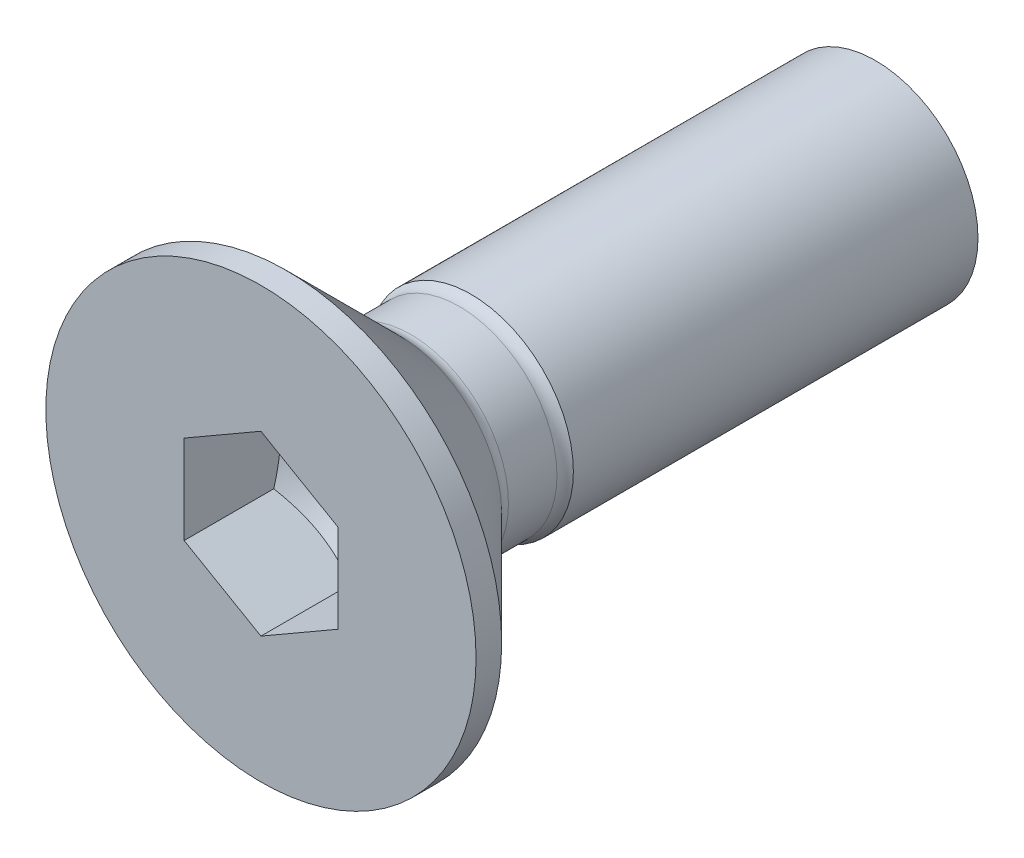
ISO-10303-21;
HEADER;
FILE_DESCRIPTION(('STEP AP214'),'2;1');
FILE_NAME('part.step','',(''),(''),'','','');
FILE_SCHEMA(('AUTOMOTIVE_DESIGN { 1 0 10303 214 1 1 1 1 }'));
ENDSEC;
DATA;
#1=APPLICATION_CONTEXT('core data for automotive mechanical design processes');
#2=APPLICATION_PROTOCOL_DEFINITION('international standard','automotive_design',2000,#1);
#3=PRODUCT_CONTEXT('',#1,'mechanical');
#4=PRODUCT('Part','Part','',(#3));
#5=PRODUCT_RELATED_PRODUCT_CATEGORY('part','',(#4));
#6=PRODUCT_DEFINITION_FORMATION('','',#4);
#7=PRODUCT_DEFINITION_CONTEXT('part definition',#1,'design');
#8=PRODUCT_DEFINITION('design','',#6,#7);
#9=PRODUCT_DEFINITION_SHAPE('','',#8);
#10=(LENGTH_UNIT() NAMED_UNIT(*) SI_UNIT(.MILLI.,.METRE.));
#11=(NAMED_UNIT(*) PLANE_ANGLE_UNIT() SI_UNIT($,.RADIAN.));
#12=(NAMED_UNIT(*) SI_UNIT($,.STERADIAN.) SOLID_ANGLE_UNIT());
#13=UNCERTAINTY_MEASURE_WITH_UNIT(LENGTH_MEASURE(1.E-05),#10,'distance_accuracy_value','');
#14=(GEOMETRIC_REPRESENTATION_CONTEXT(3) GLOBAL_UNCERTAINTY_ASSIGNED_CONTEXT((#13)) GLOBAL_UNIT_ASSIGNED_CONTEXT((#10,
#11,#12)) REPRESENTATION_CONTEXT('',''));
#15=CARTESIAN_POINT('',(0.,0.,0.));
#16=DIRECTION('',(0.,0.,1.));
#17=DIRECTION('',(1.,0.,0.));
#18=AXIS2_PLACEMENT_3D('',#15,#16,#17);
#19=CARTESIAN_POINT('',(0.,4.2,0.));
#20=DIRECTION('',(0.,0.,-1.));
#21=DIRECTION('',(-1.,0.,0.));
#22=AXIS2_PLACEMENT_3D('',#19,#20,#21);
#23=PLANE('',#22);
#24=CARTESIAN_POINT('',(0.,0.,0.));
#25=DIRECTION('',(0.,0.,1.));
#26=DIRECTION('',(1.,0.,0.));
#27=AXIS2_PLACEMENT_3D('',#24,#25,#26);
#28=CIRCLE('',#27,4.2);
#29=CARTESIAN_POINT('',(4.2,0.,0.));
#30=VERTEX_POINT('',#29);
#31=EDGE_CURVE('E107',#30,#30,#28,.T.);
#32=ORIENTED_EDGE('',*,*,#31,.T.);
#33=EDGE_LOOP('',(#32));
#34=FACE_BOUND('',#33,.T.);
#35=DIRECTION('',(-0.866025403784438,-0.5,0.));
#36=VECTOR('',#35,1.);
#37=CARTESIAN_POINT('',(1.49999930062484,-0.866025,0.));
#38=LINE('',#37,#36);
#39=CARTESIAN_POINT('',(1.49999930062484,-0.866025,0.));
#40=VERTEX_POINT('',#39);
#41=CARTESIAN_POINT('',(0.,-1.73205,0.));
#42=VERTEX_POINT('',#41);
#43=EDGE_CURVE('E31',#40,#42,#38,.T.);
#44=ORIENTED_EDGE('',*,*,#43,.T.);
#45=DIRECTION('',(-0.866025403784439,0.5,0.));
#46=VECTOR('',#45,1.);
#47=CARTESIAN_POINT('',(0.,-1.73205,0.));
#48=LINE('',#47,#46);
#49=CARTESIAN_POINT('',(-1.49999930062484,-0.866025,0.));
#50=VERTEX_POINT('',#49);
#51=EDGE_CURVE('E174',#42,#50,#48,.T.);
#52=ORIENTED_EDGE('',*,*,#51,.T.);
#53=DIRECTION('',(0.,1.,0.));
#54=VECTOR('',#53,1.);
#55=CARTESIAN_POINT('',(-1.49999930062484,-0.866025,0.));
#56=LINE('',#55,#54);
#57=CARTESIAN_POINT('',(-1.49999930062484,0.866025,0.));
#58=VERTEX_POINT('',#57);
#59=EDGE_CURVE('E225',#50,#58,#56,.T.);
#60=ORIENTED_EDGE('',*,*,#59,.T.);
#61=DIRECTION('',(0.866025403784439,0.5,0.));
#62=VECTOR('',#61,1.);
#63=CARTESIAN_POINT('',(-1.49999930062484,0.866025,0.));
#64=LINE('',#63,#62);
#65=CARTESIAN_POINT('',(0.,1.73205,0.));
#66=VERTEX_POINT('',#65);
#67=EDGE_CURVE('E223',#58,#66,#64,.T.);
#68=ORIENTED_EDGE('',*,*,#67,.T.);
#69=DIRECTION('',(0.866025403784439,-0.5,0.));
#70=VECTOR('',#69,1.);
#71=CARTESIAN_POINT('',(0.,1.73205,0.));
#72=LINE('',#71,#70);
#73=CARTESIAN_POINT('',(1.49999930062484,0.866025,0.));
#74=VERTEX_POINT('',#73);
#75=EDGE_CURVE('E96',#66,#74,#72,.T.);
#76=ORIENTED_EDGE('',*,*,#75,.T.);
#77=DIRECTION('',(0.,-1.,0.));
#78=VECTOR('',#77,1.);
#79=CARTESIAN_POINT('',(1.49999930062484,0.866025,0.));
#80=LINE('',#79,#78);
#81=EDGE_CURVE('E92',#74,#40,#80,.T.);
#82=ORIENTED_EDGE('',*,*,#81,.T.);
#83=EDGE_LOOP('',(#44,#52,#60,#68,#76,#82));
#84=FACE_BOUND('',#83,.T.);
#85=ADVANCED_FACE('F17',(#34,#84),#23,.F.);
#86=CARTESIAN_POINT('',(0.,0.,-12.));
#87=DIRECTION('',(0.,0.,1.));
#88=DIRECTION('',(1.,0.,0.));
#89=AXIS2_PLACEMENT_3D('',#86,#87,#88);
#90=PLANE('',#89);
#91=CARTESIAN_POINT('',(0.,0.,-12.));
#92=DIRECTION('',(0.,0.,1.));
#93=DIRECTION('',(1.,0.,0.));
#94=AXIS2_PLACEMENT_3D('',#91,#92,#93);
#95=CIRCLE('',#94,2.);
#96=CARTESIAN_POINT('',(2.,0.,-12.));
#97=VERTEX_POINT('',#96);
#98=EDGE_CURVE('E11',#97,#97,#95,.T.);
#99=ORIENTED_EDGE('',*,*,#98,.F.);
#100=EDGE_LOOP('',(#99));
#101=FACE_BOUND('',#100,.T.);
#102=ADVANCED_FACE('F130',(#101),#90,.F.);
#103=CARTESIAN_POINT('',(0.,0.,0.));
#104=DIRECTION('',(0.,0.,1.));
#105=DIRECTION('',(1.,0.,0.));
#106=AXIS2_PLACEMENT_3D('',#103,#104,#105);
#107=CYLINDRICAL_SURFACE('',#106,2.);
#108=CARTESIAN_POINT('',(0.,0.,-4.1));
#109=DIRECTION('',(0.,0.,1.));
#110=DIRECTION('',(1.,0.,0.));
#111=AXIS2_PLACEMENT_3D('',#108,#109,#110);
#112=CIRCLE('',#111,2.);
#113=CARTESIAN_POINT('',(2.,0.,-4.1));
#114=VERTEX_POINT('',#113);
#115=EDGE_CURVE('E24',#114,#114,#112,.T.);
#116=ORIENTED_EDGE('',*,*,#115,.F.);
#117=EDGE_LOOP('',(#116));
#118=FACE_BOUND('',#117,.T.);
#119=ORIENTED_EDGE('',*,*,#98,.T.);
#120=EDGE_LOOP('',(#119));
#121=FACE_BOUND('',#120,.T.);
#122=ADVANCED_FACE('F127',(#118,#121),#107,.T.);
#123=CARTESIAN_POINT('',(0.,0.,-3.8737258300203));
#124=DIRECTION('',(0.,0.,1.));
#125=DIRECTION('',(1.,0.,0.));
#126=AXIS2_PLACEMENT_3D('',#123,#124,#125);
#127=TOROIDAL_SURFACE('',#126,2.2262741699797,0.32);
#128=ORIENTED_EDGE('',*,*,#115,.T.);
#129=EDGE_LOOP('',(#128));
#130=FACE_BOUND('',#129,.T.);
#131=CARTESIAN_POINT('',(0.,0.,-3.8737258300203));
#132=DIRECTION('',(0.,0.,1.));
#133=DIRECTION('',(1.,0.,0.));
#134=AXIS2_PLACEMENT_3D('',#131,#132,#133);
#135=CIRCLE('',#134,1.9062741699797);
#136=CARTESIAN_POINT('',(1.9062741699797,0.,-3.8737258300203));
#137=VERTEX_POINT('',#136);
#138=EDGE_CURVE('E119',#137,#137,#135,.T.);
#139=ORIENTED_EDGE('',*,*,#138,.F.);
#140=EDGE_LOOP('',(#139));
#141=FACE_BOUND('',#140,.T.);
#142=ADVANCED_FACE('F124',(#130,#141),#127,.F.);
#143=CARTESIAN_POINT('',(0.,0.,0.));
#144=DIRECTION('',(0.,0.,1.));
#145=DIRECTION('',(1.,0.,0.));
#146=AXIS2_PLACEMENT_3D('',#143,#144,#145);
#147=CYLINDRICAL_SURFACE('',#146,1.9062741699797);
#148=CARTESIAN_POINT('',(0.,0.,-2.9262741699797));
#149=DIRECTION('',(0.,0.,1.));
#150=DIRECTION('',(1.,0.,0.));
#151=AXIS2_PLACEMENT_3D('',#148,#149,#150);
#152=CIRCLE('',#151,1.9062741699797);
#153=CARTESIAN_POINT('',(1.9062741699797,0.,-2.9262741699797));
#154=VERTEX_POINT('',#153);
#155=EDGE_CURVE('E116',#154,#154,#152,.T.);
#156=ORIENTED_EDGE('',*,*,#155,.F.);
#157=EDGE_LOOP('',(#156));
#158=FACE_BOUND('',#157,.T.);
#159=ORIENTED_EDGE('',*,*,#138,.T.);
#160=EDGE_LOOP('',(#159));
#161=FACE_BOUND('',#160,.T.);
#162=ADVANCED_FACE('F143',(#158,#161),#147,.T.);
#163=CARTESIAN_POINT('',(0.,0.,-2.9262741699797));
#164=DIRECTION('',(0.,0.,1.));
#165=DIRECTION('',(1.,0.,0.));
#166=AXIS2_PLACEMENT_3D('',#163,#164,#165);
#167=TOROIDAL_SURFACE('',#166,2.2262741699797,0.32);
#168=ORIENTED_EDGE('',*,*,#155,.T.);
#169=EDGE_LOOP('',(#168));
#170=FACE_BOUND('',#169,.T.);
#171=CARTESIAN_POINT('',(0.,0.,-2.7));
#172=DIRECTION('',(0.,0.,1.));
#173=DIRECTION('',(1.,0.,0.));
#174=AXIS2_PLACEMENT_3D('',#171,#172,#173);
#175=CIRCLE('',#174,2.);
#176=CARTESIAN_POINT('',(2.,0.,-2.7));
#177=VERTEX_POINT('',#176);
#178=EDGE_CURVE('E113',#177,#177,#175,.T.);
#179=ORIENTED_EDGE('',*,*,#178,.F.);
#180=EDGE_LOOP('',(#179));
#181=FACE_BOUND('',#180,.T.);
#182=ADVANCED_FACE('F146',(#170,#181),#167,.F.);
#183=CARTESIAN_POINT('',(0.,0.,-2.7));
#184=DIRECTION('',(0.,0.,1.));
#185=DIRECTION('',(1.,0.,0.));
#186=AXIS2_PLACEMENT_3D('',#183,#184,#185);
#187=CONICAL_SURFACE('',#186,2.,0.785398163397448);
#188=CARTESIAN_POINT('',(0.,0.,-0.5));
#189=DIRECTION('',(0.,0.,1.));
#190=DIRECTION('',(1.,0.,0.));
#191=AXIS2_PLACEMENT_3D('',#188,#189,#190);
#192=CIRCLE('',#191,4.2);
#193=CARTESIAN_POINT('',(4.2,0.,-0.5));
#194=VERTEX_POINT('',#193);
#195=EDGE_CURVE('E110',#194,#194,#192,.T.);
#196=ORIENTED_EDGE('',*,*,#195,.F.);
#197=EDGE_LOOP('',(#196));
#198=FACE_BOUND('',#197,.T.);
#199=ORIENTED_EDGE('',*,*,#178,.T.);
#200=EDGE_LOOP('',(#199));
#201=FACE_BOUND('',#200,.T.);
#202=ADVANCED_FACE('F150',(#198,#201),#187,.T.);
#203=CARTESIAN_POINT('',(0.,0.,0.));
#204=DIRECTION('',(0.,0.,1.));
#205=DIRECTION('',(1.,0.,0.));
#206=AXIS2_PLACEMENT_3D('',#203,#204,#205);
#207=CYLINDRICAL_SURFACE('',#206,4.2);
#208=ORIENTED_EDGE('',*,*,#31,.F.);
#209=EDGE_LOOP('',(#208));
#210=FACE_BOUND('',#209,.T.);
#211=ORIENTED_EDGE('',*,*,#195,.T.);
#212=EDGE_LOOP('',(#211));
#213=FACE_BOUND('',#212,.T.);
#214=ADVANCED_FACE('F154',(#210,#213),#207,.T.);
#215=CARTESIAN_POINT('',(1.49999930062484,-0.866025,-2.74999953374989));
#216=DIRECTION('',(-0.5,0.866025403784438,0.));
#217=DIRECTION('',(0.866025403784439,0.5,0.));
#218=AXIS2_PLACEMENT_3D('',#215,#216,#217);
#219=PLANE('',#218);
#220=DIRECTION('',(0.,0.,1.));
#221=VECTOR('',#220,1.);
#222=CARTESIAN_POINT('',(0.,-1.73205,-2.74999953374989));
#223=LINE('',#222,#221);
#224=CARTESIAN_POINT('',(0.,-1.73205,-1.75));
#225=VERTEX_POINT('',#224);
#226=EDGE_CURVE('E105',#225,#42,#223,.T.);
#227=ORIENTED_EDGE('',*,*,#226,.T.);
#228=ORIENTED_EDGE('',*,*,#43,.F.);
#229=DIRECTION('',(0.,0.,1.));
#230=VECTOR('',#229,1.);
#231=CARTESIAN_POINT('',(1.49999930062484,-0.866025,-2.74999953374989));
#232=LINE('',#231,#230);
#233=CARTESIAN_POINT('',(1.49999930062484,-0.866025,-1.75));
#234=VERTEX_POINT('',#233);
#235=EDGE_CURVE('E86',#234,#40,#232,.T.);
#236=ORIENTED_EDGE('',*,*,#235,.F.);
#237=CARTESIAN_POINT('',(-1.99999999680739E-07,-1.73205011547005,-1.74999993333332));
#238=CARTESIAN_POINT('',(0.0659156883140374,-1.69399355960807,-1.77197826971665));
#239=CARTESIAN_POINT('',(0.132400561630831,-1.65560850010158,-1.79196641723317));
#240=CARTESIAN_POINT('',(0.266521449648073,-1.57817376930088,-1.82685513031264));
#241=CARTESIAN_POINT('',(0.334159846643437,-1.53912272258805,-1.84174335491524));
#242=CARTESIAN_POINT('',(0.468598431785278,-1.46150456926693,-1.86491795250505));
#243=CARTESIAN_POINT('',(0.535377940612902,-1.42294940186895,-1.87335858322253));
#244=CARTESIAN_POINT('',(0.669251014383081,-1.3456577466905,-1.88343305499451));
#245=CARTESIAN_POINT('',(0.736344093066486,-1.30692153965187,-1.88507524057936));
#246=CARTESIAN_POINT('',(0.861700339375889,-1.23454707710054,-1.88165022910074));
#247=CARTESIAN_POINT('',(0.919982317618543,-1.20089796127324,-1.87742398588357));
#248=CARTESIAN_POINT('',(1.03616658598195,-1.13381894265803,-1.86403197749463));
#249=CARTESIAN_POINT('',(1.09406847455153,-1.10038927170579,-1.8548616421055));
#250=CARTESIAN_POINT('',(1.21049209394498,-1.03317206370895,-1.83193757598473));
#251=CARTESIAN_POINT('',(1.26899909720332,-0.99939302962827,-1.81808671686208));
#252=CARTESIAN_POINT('',(1.38514072357652,-0.932338630377582,-1.78665112132236));
#253=CARTESIAN_POINT('',(1.44277683345494,-0.899062406824236,-1.76907376628985));
#254=CARTESIAN_POINT('',(1.49999950062484,-0.866024884529945,-1.74999993333332));
#255=B_SPLINE_CURVE_WITH_KNOTS('',3,(#237,#238,#239,#240,#241,#242,#243,#244,#245,#246,#247,
#248,#249,#250,#251,#252,#253,#254),.UNSPECIFIED.,.F.,.F.,(4,2,2,2,2,2,2,2,4),(0.,
0.237761913623106,0.476095172847885,0.708530420620331,0.940680288567599,1.14278046683928,
1.34506778348019,1.5518408666055,1.75820814090333),.UNSPECIFIED.);
#256=EDGE_CURVE('E79',#225,#234,#255,.T.);
#257=ORIENTED_EDGE('',*,*,#256,.F.);
#258=EDGE_LOOP('',(#227,#228,#236,#257));
#259=FACE_BOUND('',#258,.T.);
#260=ADVANCED_FACE('F87',(#259),#219,.T.);
#261=CARTESIAN_POINT('',(0.,-1.73205,-2.74999953374989));
#262=DIRECTION('',(0.5,0.866025403784439,0.));
#263=DIRECTION('',(0.866025403784439,-0.5,0.));
#264=AXIS2_PLACEMENT_3D('',#261,#262,#263);
#265=PLANE('',#264);
#266=DIRECTION('',(0.,0.,1.));
#267=VECTOR('',#266,1.);
#268=CARTESIAN_POINT('',(-1.49999930062484,-0.866025,-2.74999953374989));
#269=LINE('',#268,#267);
#270=CARTESIAN_POINT('',(-1.49999930062484,-0.866025,-1.75));
#271=VERTEX_POINT('',#270);
#272=EDGE_CURVE('E103',#271,#50,#269,.T.);
#273=ORIENTED_EDGE('',*,*,#272,.T.);
#274=ORIENTED_EDGE('',*,*,#51,.F.);
#275=ORIENTED_EDGE('',*,*,#226,.F.);
#276=CARTESIAN_POINT('',(-1.49999950062484,-0.866024884529947,-1.74999993333332));
#277=CARTESIAN_POINT('',(-1.4340836123108,-0.904081440391929,-1.77197826971665));
#278=CARTESIAN_POINT('',(-1.36759873899401,-0.942466499898418,-1.79196641723317));
#279=CARTESIAN_POINT('',(-1.23347785097676,-1.01990123069912,-1.82685513031264));
#280=CARTESIAN_POINT('',(-1.1658394539814,-1.05895227741195,-1.84174335491524));
#281=CARTESIAN_POINT('',(-1.03140086883956,-1.13657043073307,-1.86491795250505));
#282=CARTESIAN_POINT('',(-0.964621360011935,-1.17512559813105,-1.87335858322253));
#283=CARTESIAN_POINT('',(-0.830748286241757,-1.2524172533095,-1.88343305499451));
#284=CARTESIAN_POINT('',(-0.763655207558351,-1.29115346034813,-1.88507524057936));
#285=CARTESIAN_POINT('',(-0.638298961248948,-1.36352792289946,-1.88165022910074));
#286=CARTESIAN_POINT('',(-0.580016983006295,-1.39717703872676,-1.87742398588357));
#287=CARTESIAN_POINT('',(-0.46383271464289,-1.46425605734197,-1.86403197749463));
#288=CARTESIAN_POINT('',(-0.405930826073305,-1.49768572829421,-1.8548616421055));
#289=CARTESIAN_POINT('',(-0.289507206679853,-1.56490293629105,-1.83193757598473));
#290=CARTESIAN_POINT('',(-0.231000203421515,-1.59868197037173,-1.81808671686208));
#291=CARTESIAN_POINT('',(-0.114858577048315,-1.66573636962242,-1.78665112132236));
#292=CARTESIAN_POINT('',(-0.0572224671698999,-1.69901259317576,-1.76907376628985));
#293=CARTESIAN_POINT('',(2.00000000349948E-07,-1.73205011547005,-1.74999993333332));
#294=B_SPLINE_CURVE_WITH_KNOTS('',3,(#276,#277,#278,#279,#280,#281,#282,#283,#284,#285,#286,
#287,#288,#289,#290,#291,#292,#293),.UNSPECIFIED.,.F.,.F.,(4,2,2,2,2,2,2,2,4),(0.,
0.237761913623106,0.476095172847884,0.70853042062033,0.940680288567598,1.14278046683928,
1.34506778348018,1.5518408666055,1.75820814090332),.UNSPECIFIED.);
#295=EDGE_CURVE('E83',#271,#225,#294,.T.);
#296=ORIENTED_EDGE('',*,*,#295,.F.);
#297=EDGE_LOOP('',(#273,#274,#275,#296));
#298=FACE_BOUND('',#297,.T.);
#299=ADVANCED_FACE('F162',(#298),#265,.T.);
#300=CARTESIAN_POINT('',(-1.49999930062484,-0.866025,-2.74999953374989));
#301=DIRECTION('',(1.,0.,0.));
#302=DIRECTION('',(0.,-1.,0.));
#303=AXIS2_PLACEMENT_3D('',#300,#301,#302);
#304=PLANE('',#303);
#305=DIRECTION('',(0.,0.,1.));
#306=VECTOR('',#305,1.);
#307=CARTESIAN_POINT('',(-1.49999930062484,0.866025,-2.74999953374989));
#308=LINE('',#307,#306);
#309=CARTESIAN_POINT('',(-1.49999930062484,0.866025,-1.75));
#310=VERTEX_POINT('',#309);
#311=EDGE_CURVE('E101',#310,#58,#308,.T.);
#312=ORIENTED_EDGE('',*,*,#311,.T.);
#313=ORIENTED_EDGE('',*,*,#59,.F.);
#314=ORIENTED_EDGE('',*,*,#272,.F.);
#315=CARTESIAN_POINT('',(-1.49999930062484,-2.24271663728987,-1.19224732655606));
#316=CARTESIAN_POINT('',(-1.49999930062484,-2.17794141332948,-1.2233240386434));
#317=CARTESIAN_POINT('',(-1.49999930062484,-2.11300852131877,-1.25407788378193));
#318=CARTESIAN_POINT('',(-1.49999930062484,-1.98274303133747,-1.31475688836461));
#319=CARTESIAN_POINT('',(-1.49999930062484,-1.91741036398295,-1.34468189867359));
#320=CARTESIAN_POINT('',(-1.49999930062484,-1.78588635402014,-1.40368745902238));
#321=CARTESIAN_POINT('',(-1.49999930062484,-1.71969220668951,-1.43276178539196));
#322=CARTESIAN_POINT('',(-1.49999930062484,-1.58674953033079,-1.48960603309075));
#323=CARTESIAN_POINT('',(-1.49999930062484,-1.52000103034101,-1.51737602224337));
#324=CARTESIAN_POINT('',(-1.49999930062484,-1.3840803609041,-1.57197454354563));
#325=CARTESIAN_POINT('',(-1.49999930062484,-1.31489044693085,-1.59875948860863));
#326=CARTESIAN_POINT('',(-1.49999930062484,-1.17568875841829,-1.65009347176015));
#327=CARTESIAN_POINT('',(-1.49999930062484,-1.10567688213164,-1.67464222967457));
#328=CARTESIAN_POINT('',(-1.49999930062484,-0.894522216326041,-1.74389891659258));
#329=CARTESIAN_POINT('',(-1.49999930062484,-0.751873977107305,-1.78437972558077));
#330=CARTESIAN_POINT('',(-1.49999930062484,-0.535047450977377,-1.83133547387975));
#331=CARTESIAN_POINT('',(-1.49999930062484,-0.462365424606004,-1.8446870831194));
#332=CARTESIAN_POINT('',(-1.49999930062484,-0.316183762846173,-1.86588652327433));
#333=CARTESIAN_POINT('',(-1.49999930062484,-0.242684183050493,-1.8737347261193));
#334=CARTESIAN_POINT('',(-1.49999930062484,-0.0961588910043363,-1.88320140065941));
#335=CARTESIAN_POINT('',(-1.49999930062484,-0.0231380525219725,-1.88489338760043));
#336=CARTESIAN_POINT('',(-1.49999930062484,0.122783022434944,-1.8821005129235));
#337=CARTESIAN_POINT('',(-1.49999930062484,0.195683251162014,-1.87761526883626));
#338=CARTESIAN_POINT('',(-1.49999930062484,0.375553746456918,-1.85932231507839));
#339=CARTESIAN_POINT('',(-1.49999930062484,0.482175447205275,-1.84208645808823));
#340=CARTESIAN_POINT('',(-1.49999930062484,0.693345462610581,-1.79764015601861));
#341=CARTESIAN_POINT('',(-1.49999930062484,0.797891117586182,-1.77041768916732));
#342=CARTESIAN_POINT('',(-1.49999930062484,0.954250638106052,-1.72391506406641));
#343=CARTESIAN_POINT('',(-1.49999930062484,1.00687274489346,-1.70725248222542));
#344=CARTESIAN_POINT('',(-1.49999930062484,1.11156919653989,-1.67238593435544));
#345=CARTESIAN_POINT('',(-1.49999930062484,1.16364386074615,-1.65418293026923));
#346=CARTESIAN_POINT('',(-1.49999930062484,1.26731501759716,-1.61649989905804));
#347=CARTESIAN_POINT('',(-1.49999930062484,1.31891159520743,-1.59702010401285));
#348=CARTESIAN_POINT('',(-1.49999930062484,1.4216981870033,-1.55699419612349));
#349=CARTESIAN_POINT('',(-1.49999930062484,1.472888130803,-1.53644790312054));
#350=CARTESIAN_POINT('',(-1.49999930062484,1.60355204827236,-1.48268670520898));
#351=CARTESIAN_POINT('',(-1.49999930062484,1.68276475840259,-1.44883749105937));
#352=CARTESIAN_POINT('',(-1.49999930062484,1.84047486348128,-1.37950734216129));
#353=CARTESIAN_POINT('',(-1.49999930062484,1.91897220431401,-1.34402628517604));
#354=CARTESIAN_POINT('',(-1.49999930062484,2.15362953028614,-1.23571059000565));
#355=CARTESIAN_POINT('',(-1.49999930062484,2.30892860814982,-1.16101453187262));
#356=CARTESIAN_POINT('',(-1.49999930062484,2.61819999305394,-1.00848967602052));
#357=CARTESIAN_POINT('',(-1.49999930062484,2.77217043436165,-0.930657140019653));
#358=CARTESIAN_POINT('',(-1.49999930062484,3.07905639824251,-0.772990738398717));
#359=CARTESIAN_POINT('',(-1.49999930062484,3.23197205178397,-0.693157127162421));
#360=CARTESIAN_POINT('',(-1.49999930062484,3.52267463488272,-0.539711530968817));
#361=CARTESIAN_POINT('',(-1.49999930062484,3.66052723146041,-0.466223520484862));
#362=CARTESIAN_POINT('',(-1.49999930062484,3.93578899181439,-0.318410175118091));
#363=CARTESIAN_POINT('',(-1.49999930062484,4.07319813893701,-0.244084809248649));
#364=CARTESIAN_POINT('',(-1.49999930062484,4.34732572273338,-0.0949965837001696));
#365=CARTESIAN_POINT('',(-1.49999930062484,4.48404502727542,-0.0202353176334689));
#366=CARTESIAN_POINT('',(-1.49999930062484,4.75720722150035,0.129773804682777));
#367=CARTESIAN_POINT('',(-1.49999930062484,4.89365012527411,0.205021635263442));
#368=CARTESIAN_POINT('',(-1.49999930062484,5.02999372439214,0.280447890272913));
#369=B_SPLINE_CURVE_WITH_KNOTS('',3,(#315,#316,#317,#318,#319,#320,#321,#322,#323,#324,#325,
#326,#327,#328,#329,#330,#331,#332,#333,#334,#335,#336,#337,#338,#339,#340,#341,#342,#343,#344,
#345,#346,#347,#348,#349,#350,#351,#352,#353,#354,#355,#356,#357,#358,#359,#360,#361,#362,#363,
#364,#365,#366,#367,#368),.UNSPECIFIED.,.F.,.F.,(4,2,2,2,2,2,2,2,2,2,2,2,2,2,2,2,2,2,2,2,2,2,2,
2,2,2,4),(0.,0.215535408956196,0.431109351278167,0.647990972797856,0.864861304313613,
1.08740082366361,1.30996818696955,1.75384735851112,1.97537373295003,2.19688513481169,
2.41574248382809,2.63461338422011,2.95796620177289,3.28170955208695,3.4472828330585,
3.61275347137016,3.77819411537379,3.94366279806472,4.20206177941054,4.46048014832696,
4.97740223788562,5.49495979450924,6.012451887764,6.48110033243706,6.94976617694737,
7.41723996592479,7.88468929116012),.UNSPECIFIED.);
#370=EDGE_CURVE('E199',#310,#271,#369,.F.);
#371=ORIENTED_EDGE('',*,*,#370,.F.);
#372=EDGE_LOOP('',(#312,#313,#314,#371));
#373=FACE_BOUND('',#372,.T.);
#374=ADVANCED_FACE('F203',(#373),#304,.T.);
#375=CARTESIAN_POINT('',(-1.49999930062484,0.866025,-2.74999953374989));
#376=DIRECTION('',(0.5,-0.866025403784439,0.));
#377=DIRECTION('',(-0.866025403784439,-0.5,0.));
#378=AXIS2_PLACEMENT_3D('',#375,#376,#377);
#379=PLANE('',#378);
#380=DIRECTION('',(0.,0.,1.));
#381=VECTOR('',#380,1.);
#382=CARTESIAN_POINT('',(0.,1.73205,-2.74999953374989));
#383=LINE('',#382,#381);
#384=CARTESIAN_POINT('',(0.,1.73205,-1.75));
#385=VERTEX_POINT('',#384);
#386=EDGE_CURVE('E94',#385,#66,#383,.T.);
#387=ORIENTED_EDGE('',*,*,#386,.T.);
#388=ORIENTED_EDGE('',*,*,#67,.F.);
#389=ORIENTED_EDGE('',*,*,#311,.F.);
#390=CARTESIAN_POINT('',(1.99999999841384E-07,1.73205011547005,-1.74999993333332));
#391=CARTESIAN_POINT('',(-0.0659156883140364,1.69399355960807,-1.77197826971665));
#392=CARTESIAN_POINT('',(-0.13240056163083,1.65560850010158,-1.79196641723317));
#393=CARTESIAN_POINT('',(-0.266521449648072,1.57817376930088,-1.82685513031264));
#394=CARTESIAN_POINT('',(-0.334159846643437,1.53912272258805,-1.84174335491524));
#395=CARTESIAN_POINT('',(-0.468598431785278,1.46150456926693,-1.86491795250505));
#396=CARTESIAN_POINT('',(-0.535377940612901,1.42294940186895,-1.87335858322253));
#397=CARTESIAN_POINT('',(-0.66925101438308,1.3456577466905,-1.88343305499451));
#398=CARTESIAN_POINT('',(-0.736344093066486,1.30692153965187,-1.88507524057936));
#399=CARTESIAN_POINT('',(-0.861700339375889,1.23454707710054,-1.88165022910074));
#400=CARTESIAN_POINT('',(-0.919982317618542,1.20089796127324,-1.87742398588357));
#401=CARTESIAN_POINT('',(-1.03616658598195,1.13381894265803,-1.86403197749463));
#402=CARTESIAN_POINT('',(-1.09406847455153,1.10038927170579,-1.8548616421055));
#403=CARTESIAN_POINT('',(-1.21049209394498,1.03317206370895,-1.83193757598473));
#404=CARTESIAN_POINT('',(-1.26899909720332,0.99939302962827,-1.81808671686208));
#405=CARTESIAN_POINT('',(-1.38514072357652,0.932338630377582,-1.78665112132236));
#406=CARTESIAN_POINT('',(-1.44277683345494,0.899062406824237,-1.76907376628985));
#407=CARTESIAN_POINT('',(-1.49999950062484,0.866024884529946,-1.74999993333332));
#408=B_SPLINE_CURVE_WITH_KNOTS('',3,(#390,#391,#392,#393,#394,#395,#396,#397,#398,#399,#400,
#401,#402,#403,#404,#405,#406,#407),.UNSPECIFIED.,.F.,.F.,(4,2,2,2,2,2,2,2,4),(0.,
0.237761913623107,0.476095172847885,0.708530420620331,0.940680288567599,1.14278046683928,
1.34506778348018,1.5518408666055,1.75820814090332),.UNSPECIFIED.);
#409=EDGE_CURVE('E194',#385,#310,#408,.T.);
#410=ORIENTED_EDGE('',*,*,#409,.F.);
#411=EDGE_LOOP('',(#387,#388,#389,#410));
#412=FACE_BOUND('',#411,.T.);
#413=ADVANCED_FACE('F206',(#412),#379,.T.);
#414=CARTESIAN_POINT('',(0.,1.73205,-2.74999953374989));
#415=DIRECTION('',(-0.5,-0.866025403784439,0.));
#416=DIRECTION('',(-0.866025403784439,0.5,0.));
#417=AXIS2_PLACEMENT_3D('',#414,#415,#416);
#418=PLANE('',#417);
#419=DIRECTION('',(0.,0.,1.));
#420=VECTOR('',#419,1.);
#421=CARTESIAN_POINT('',(1.49999930062484,0.866025,-2.74999953374989));
#422=LINE('',#421,#420);
#423=CARTESIAN_POINT('',(1.49999930062484,0.866025,-1.75));
#424=VERTEX_POINT('',#423);
#425=EDGE_CURVE('E91',#424,#74,#422,.T.);
#426=ORIENTED_EDGE('',*,*,#425,.T.);
#427=ORIENTED_EDGE('',*,*,#75,.F.);
#428=ORIENTED_EDGE('',*,*,#386,.F.);
#429=CARTESIAN_POINT('',(1.49999950062484,0.866024884529947,-1.74999993333332));
#430=CARTESIAN_POINT('',(1.4340836123108,0.90408144039193,-1.77197826971665));
#431=CARTESIAN_POINT('',(1.36759873899401,0.942466499898419,-1.79196641723317));
#432=CARTESIAN_POINT('',(1.23347785097676,1.01990123069912,-1.82685513031264));
#433=CARTESIAN_POINT('',(1.1658394539814,1.05895227741195,-1.84174335491524));
#434=CARTESIAN_POINT('',(1.03140086883956,1.13657043073307,-1.86491795250505));
#435=CARTESIAN_POINT('',(0.964621360011935,1.17512559813105,-1.87335858322253));
#436=CARTESIAN_POINT('',(0.830748286241757,1.2524172533095,-1.88343305499451));
#437=CARTESIAN_POINT('',(0.763655207558351,1.29115346034813,-1.88507524057936));
#438=CARTESIAN_POINT('',(0.638298961248948,1.36352792289946,-1.88165022910074));
#439=CARTESIAN_POINT('',(0.580016983006295,1.39717703872676,-1.87742398588357));
#440=CARTESIAN_POINT('',(0.46383271464289,1.46425605734197,-1.86403197749463));
#441=CARTESIAN_POINT('',(0.405930826073305,1.49768572829421,-1.8548616421055));
#442=CARTESIAN_POINT('',(0.289507206679854,1.56490293629105,-1.83193757598473));
#443=CARTESIAN_POINT('',(0.231000203421515,1.59868197037173,-1.81808671686208));
#444=CARTESIAN_POINT('',(0.114858577048315,1.66573636962242,-1.78665112132236));
#445=CARTESIAN_POINT('',(0.0572224671699001,1.69901259317576,-1.76907376628985));
#446=CARTESIAN_POINT('',(-2.00000000340445E-07,1.73205011547005,-1.74999993333332));
#447=B_SPLINE_CURVE_WITH_KNOTS('',3,(#429,#430,#431,#432,#433,#434,#435,#436,#437,#438,#439,
#440,#441,#442,#443,#444,#445,#446),.UNSPECIFIED.,.F.,.F.,(4,2,2,2,2,2,2,2,4),(0.,
0.237761913623106,0.476095172847884,0.70853042062033,0.940680288567598,1.14278046683928,
1.34506778348018,1.5518408666055,1.75820814090332),.UNSPECIFIED.);
#448=EDGE_CURVE('E39',#424,#385,#447,.T.);
#449=ORIENTED_EDGE('',*,*,#448,.F.);
#450=EDGE_LOOP('',(#426,#427,#428,#449));
#451=FACE_BOUND('',#450,.T.);
#452=ADVANCED_FACE('F210',(#451),#418,.T.);
#453=CARTESIAN_POINT('',(1.49999930062484,0.866025,-2.74999953374989));
#454=DIRECTION('',(-1.,0.,0.));
#455=DIRECTION('',(0.,1.,0.));
#456=AXIS2_PLACEMENT_3D('',#453,#454,#455);
#457=PLANE('',#456);
#458=ORIENTED_EDGE('',*,*,#235,.T.);
#459=ORIENTED_EDGE('',*,*,#81,.F.);
#460=ORIENTED_EDGE('',*,*,#425,.F.);
#461=CARTESIAN_POINT('',(1.49999930062484,-2.24271663728987,-1.19224732655605));
#462=CARTESIAN_POINT('',(1.49999930062484,-2.17794141332948,-1.2233240386434));
#463=CARTESIAN_POINT('',(1.49999930062484,-2.11300852131877,-1.25407788378193));
#464=CARTESIAN_POINT('',(1.49999930062484,-1.98274303133747,-1.31475688836461));
#465=CARTESIAN_POINT('',(1.49999930062484,-1.91741036398295,-1.34468189867359));
#466=CARTESIAN_POINT('',(1.49999930062484,-1.78588635402014,-1.40368745902238));
#467=CARTESIAN_POINT('',(1.49999930062484,-1.71969220668951,-1.43276178539195));
#468=CARTESIAN_POINT('',(1.49999930062484,-1.58674953033078,-1.48960603309075));
#469=CARTESIAN_POINT('',(1.49999930062484,-1.520001030341,-1.51737602224337));
#470=CARTESIAN_POINT('',(1.49999930062484,-1.3840803609041,-1.57197454354563));
#471=CARTESIAN_POINT('',(1.49999930062484,-1.31489044693085,-1.59875948860863));
#472=CARTESIAN_POINT('',(1.49999930062484,-1.17568875841829,-1.65009347176016));
#473=CARTESIAN_POINT('',(1.49999930062484,-1.10567688213164,-1.67464222967457));
#474=CARTESIAN_POINT('',(1.49999930062484,-0.894522216326038,-1.74389891659258));
#475=CARTESIAN_POINT('',(1.49999930062484,-0.751873977107303,-1.78437972558077));
#476=CARTESIAN_POINT('',(1.49999930062484,-0.535047450977375,-1.83133547387975));
#477=CARTESIAN_POINT('',(1.49999930062484,-0.462365424606002,-1.8446870831194));
#478=CARTESIAN_POINT('',(1.49999930062484,-0.316183762846172,-1.86588652327433));
#479=CARTESIAN_POINT('',(1.49999930062484,-0.242684183050491,-1.8737347261193));
#480=CARTESIAN_POINT('',(1.49999930062484,-0.0961588910043344,-1.88320140065941));
#481=CARTESIAN_POINT('',(1.49999930062484,-0.0231380525219704,-1.88489338760043));
#482=CARTESIAN_POINT('',(1.49999930062484,0.122783022434947,-1.8821005129235));
#483=CARTESIAN_POINT('',(1.49999930062484,0.195683251162016,-1.87761526883625));
#484=CARTESIAN_POINT('',(1.49999930062484,0.375553746456921,-1.85932231507838));
#485=CARTESIAN_POINT('',(1.49999930062484,0.482175447205278,-1.84208645808823));
#486=CARTESIAN_POINT('',(1.49999930062484,0.693345462610585,-1.79764015601861));
#487=CARTESIAN_POINT('',(1.49999930062484,0.797891117586186,-1.77041768916732));
#488=CARTESIAN_POINT('',(1.49999930062484,0.954250638106056,-1.72391506406641));
#489=CARTESIAN_POINT('',(1.49999930062484,1.00687274489346,-1.70725248222542));
#490=CARTESIAN_POINT('',(1.49999930062484,1.1115691965399,-1.67238593435544));
#491=CARTESIAN_POINT('',(1.49999930062484,1.16364386074616,-1.65418293026923));
#492=CARTESIAN_POINT('',(1.49999930062484,1.26731501759717,-1.61649989905804));
#493=CARTESIAN_POINT('',(1.49999930062484,1.31891159520743,-1.59702010401285));
#494=CARTESIAN_POINT('',(1.49999930062484,1.4216981870033,-1.55699419612349));
#495=CARTESIAN_POINT('',(1.49999930062484,1.47288813080301,-1.53644790312054));
#496=CARTESIAN_POINT('',(1.49999930062484,1.60355204827237,-1.48268670520898));
#497=CARTESIAN_POINT('',(1.49999930062484,1.68276475840259,-1.44883749105937));
#498=CARTESIAN_POINT('',(1.49999930062483,1.84047486348128,-1.37950734216129));
#499=CARTESIAN_POINT('',(1.49999930062483,1.91897220431401,-1.34402628517604));
#500=CARTESIAN_POINT('',(1.49999930062483,2.15362953028615,-1.23571059000565));
#501=CARTESIAN_POINT('',(1.49999930062483,2.30892860814983,-1.16101453187262));
#502=CARTESIAN_POINT('',(1.49999930062483,2.61819999305394,-1.00848967602052));
#503=CARTESIAN_POINT('',(1.49999930062483,2.77217043436165,-0.930657140019654));
#504=CARTESIAN_POINT('',(1.49999930062483,3.07905639824251,-0.772990738398719));
#505=CARTESIAN_POINT('',(1.49999930062483,3.23197205178396,-0.693157127162424));
#506=CARTESIAN_POINT('',(1.49999930062483,3.52267463488272,-0.53971153096882));
#507=CARTESIAN_POINT('',(1.49999930062483,3.66052723146041,-0.466223520484865));
#508=CARTESIAN_POINT('',(1.49999930062483,3.93578899181439,-0.318410175118094));
#509=CARTESIAN_POINT('',(1.49999930062483,4.07319813893701,-0.244084809248652));
#510=CARTESIAN_POINT('',(1.49999930062483,4.34732572273338,-0.0949965837001719));
#511=CARTESIAN_POINT('',(1.49999930062483,4.48404502727542,-0.0202353176334704));
#512=CARTESIAN_POINT('',(1.49999930062483,4.75720722150035,0.129773804682776));
#513=CARTESIAN_POINT('',(1.49999930062483,4.89365012527411,0.205021635263442));
#514=CARTESIAN_POINT('',(1.49999930062483,5.02999372439214,0.280447890272913));
#515=B_SPLINE_CURVE_WITH_KNOTS('',3,(#461,#462,#463,#464,#465,#466,#467,#468,#469,#470,#471,
#472,#473,#474,#475,#476,#477,#478,#479,#480,#481,#482,#483,#484,#485,#486,#487,#488,#489,#490,
#491,#492,#493,#494,#495,#496,#497,#498,#499,#500,#501,#502,#503,#504,#505,#506,#507,#508,#509,
#510,#511,#512,#513,#514),.UNSPECIFIED.,.F.,.F.,(4,2,2,2,2,2,2,2,2,2,2,2,2,2,2,2,2,2,2,2,2,2,2,
2,2,2,4),(0.,0.215535408956197,0.431109351278168,0.647990972797858,0.864861304313616,
1.08740082366362,1.30996818696956,1.75384735851113,1.97537373295003,2.19688513481169,
2.4157424838281,2.63461338422011,2.9579662017729,3.28170955208696,3.44728283305851,
3.61275347137016,3.77819411537379,3.94366279806472,4.20206177941055,4.46048014832696,
4.97740223788563,5.49495979450924,6.01245188776399,6.48110033243705,6.94976617694737,
7.41723996592479,7.88468929116012),.UNSPECIFIED.);
#516=EDGE_CURVE('E80',#234,#424,#515,.T.);
#517=ORIENTED_EDGE('',*,*,#516,.F.);
#518=EDGE_LOOP('',(#458,#459,#460,#517));
#519=FACE_BOUND('',#518,.T.);
#520=ADVANCED_FACE('F75',(#519),#457,.T.);
#521=CARTESIAN_POINT('',(0.,0.,-2.74999953374989));
#522=DIRECTION('',(0.,0.,1.));
#523=DIRECTION('',(1.,0.,0.));
#524=AXIS2_PLACEMENT_3D('',#521,#522,#523);
#525=CONICAL_SURFACE('',#524,0.,1.0471975511966);
#526=CARTESIAN_POINT('',(0.,0.,-2.74999953374989));
#527=VERTEX_POINT('',#526);
#528=VERTEX_LOOP('',#527);
#529=FACE_BOUND('',#528,.T.);
#530=ORIENTED_EDGE('',*,*,#256,.T.);
#531=ORIENTED_EDGE('',*,*,#516,.T.);
#532=ORIENTED_EDGE('',*,*,#448,.T.);
#533=ORIENTED_EDGE('',*,*,#409,.T.);
#534=ORIENTED_EDGE('',*,*,#370,.T.);
#535=ORIENTED_EDGE('',*,*,#295,.T.);
#536=EDGE_LOOP('',(#530,#531,#532,#533,#534,#535));
#537=FACE_BOUND('',#536,.T.);
#538=ADVANCED_FACE('F72',(#529,#537),#525,.F.);
#539=CLOSED_SHELL('',(#85,#102,#122,#142,#162,#182,#202,#214,#260,#299,#374,#413,#452,#520,#538));
#540=MANIFOLD_SOLID_BREP('B1',#539);
#541=ADVANCED_BREP_SHAPE_REPRESENTATION('',(#18,#540),#14);
#542=SHAPE_DEFINITION_REPRESENTATION(#9,#541);
ENDSEC;
END-ISO-10303-21;
